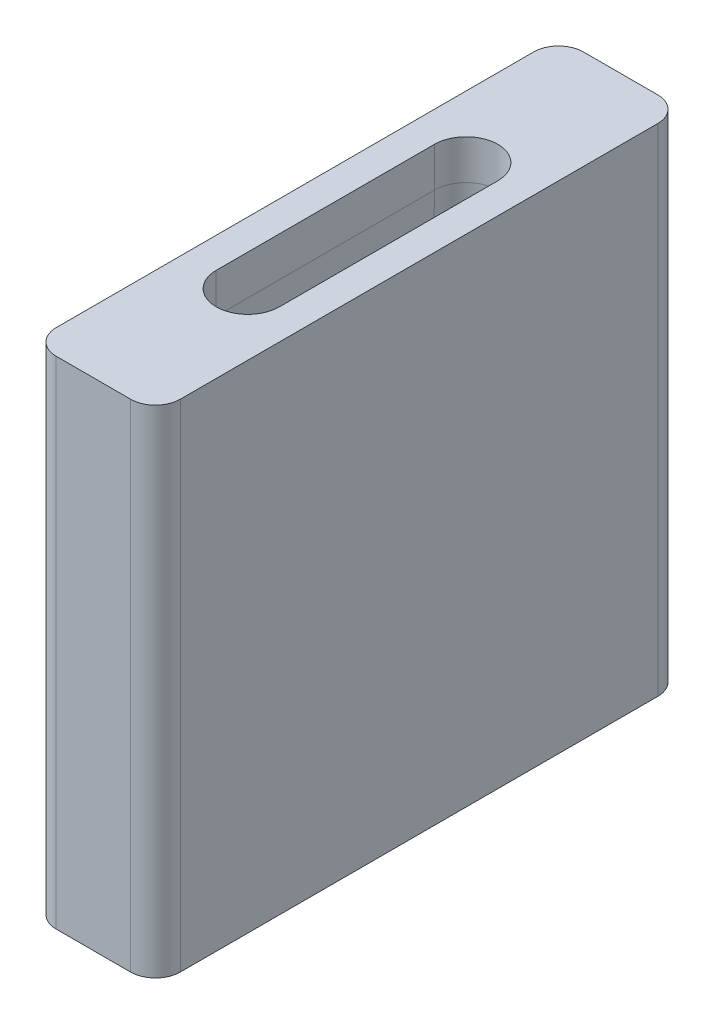
ISO-10303-21;
HEADER;
FILE_DESCRIPTION(('STEP AP214'),'2;1');
FILE_NAME('part.step','',(''),(''),'','','');
FILE_SCHEMA(('AUTOMOTIVE_DESIGN { 1 0 10303 214 1 1 1 1 }'));
ENDSEC;
DATA;
#1=APPLICATION_CONTEXT('core data for automotive mechanical design processes');
#2=APPLICATION_PROTOCOL_DEFINITION('international standard','automotive_design',2000,#1);
#3=PRODUCT_CONTEXT('',#1,'mechanical');
#4=PRODUCT('Part','Part','',(#3));
#5=PRODUCT_RELATED_PRODUCT_CATEGORY('part','',(#4));
#6=PRODUCT_DEFINITION_FORMATION('','',#4);
#7=PRODUCT_DEFINITION_CONTEXT('part definition',#1,'design');
#8=PRODUCT_DEFINITION('design','',#6,#7);
#9=PRODUCT_DEFINITION_SHAPE('','',#8);
#10=(LENGTH_UNIT() NAMED_UNIT(*) SI_UNIT(.MILLI.,.METRE.));
#11=(NAMED_UNIT(*) PLANE_ANGLE_UNIT() SI_UNIT($,.RADIAN.));
#12=(NAMED_UNIT(*) SI_UNIT($,.STERADIAN.) SOLID_ANGLE_UNIT());
#13=UNCERTAINTY_MEASURE_WITH_UNIT(LENGTH_MEASURE(1.E-05),#10,'distance_accuracy_value','');
#14=(GEOMETRIC_REPRESENTATION_CONTEXT(3) GLOBAL_UNCERTAINTY_ASSIGNED_CONTEXT((#13)) GLOBAL_UNIT_ASSIGNED_CONTEXT((#10,
#11,#12)) REPRESENTATION_CONTEXT('',''));
#15=CARTESIAN_POINT('',(0.,0.,0.));
#16=DIRECTION('',(0.,0.,1.));
#17=DIRECTION('',(1.,0.,0.));
#18=AXIS2_PLACEMENT_3D('',#15,#16,#17);
#19=CARTESIAN_POINT('',(0.,-40.001,8.8));
#20=DIRECTION('',(0.,1.,0.));
#21=DIRECTION('',(0.,0.,1.));
#22=AXIS2_PLACEMENT_3D('',#19,#20,#21);
#23=CYLINDRICAL_SURFACE('',#22,2.55);
#24=CARTESIAN_POINT('',(0.,-3.2,8.8));
#25=DIRECTION('',(0.,1.,0.));
#26=DIRECTION('',(-1.,0.,0.));
#27=AXIS2_PLACEMENT_3D('',#24,#25,#26);
#28=CIRCLE('',#27,2.55);
#29=CARTESIAN_POINT('',(-2.55,-3.2,8.8));
#30=VERTEX_POINT('',#29);
#31=CARTESIAN_POINT('',(2.55,-3.20000000000065,8.8));
#32=VERTEX_POINT('',#31);
#33=EDGE_CURVE('E75',#30,#32,#28,.T.);
#34=ORIENTED_EDGE('',*,*,#33,.F.);
#35=DIRECTION('',(0.,1.,0.));
#36=VECTOR('',#35,1.);
#37=CARTESIAN_POINT('',(-2.55,-40.001,8.8));
#38=LINE('',#37,#36);
#39=CARTESIAN_POINT('',(-2.55,0.,8.8));
#40=VERTEX_POINT('',#39);
#41=EDGE_CURVE('E238',#30,#40,#38,.T.);
#42=ORIENTED_EDGE('',*,*,#41,.T.);
#43=CARTESIAN_POINT('',(0.,0.,8.8));
#44=DIRECTION('',(0.,1.,0.));
#45=DIRECTION('',(0.,0.,1.));
#46=AXIS2_PLACEMENT_3D('',#43,#44,#45);
#47=CIRCLE('',#46,2.55);
#48=CARTESIAN_POINT('',(2.55,0.,8.8));
#49=VERTEX_POINT('',#48);
#50=EDGE_CURVE('E224',#40,#49,#47,.T.);
#51=ORIENTED_EDGE('',*,*,#50,.T.);
#52=DIRECTION('',(0.,1.,0.));
#53=VECTOR('',#52,1.);
#54=CARTESIAN_POINT('',(2.55,-40.001,8.8));
#55=LINE('',#54,#53);
#56=EDGE_CURVE('E237',#32,#49,#55,.T.);
#57=ORIENTED_EDGE('',*,*,#56,.F.);
#58=EDGE_LOOP('',(#34,#42,#51,#57));
#59=FACE_BOUND('',#58,.T.);
#60=ADVANCED_FACE('F51',(#59),#23,.F.);
#61=CARTESIAN_POINT('',(-2.55,-40.001,8.8));
#62=DIRECTION('',(-1.,0.,0.));
#63=DIRECTION('',(0.,0.,1.));
#64=AXIS2_PLACEMENT_3D('',#61,#62,#63);
#65=PLANE('',#64);
#66=DIRECTION('',(0.,0.,1.));
#67=VECTOR('',#66,1.);
#68=CARTESIAN_POINT('',(-2.55,-3.2,-8.8));
#69=LINE('',#68,#67);
#70=CARTESIAN_POINT('',(-2.55,-3.2,-8.8));
#71=VERTEX_POINT('',#70);
#72=EDGE_CURVE('E212',#71,#30,#69,.T.);
#73=ORIENTED_EDGE('',*,*,#72,.F.);
#74=DIRECTION('',(0.,1.,0.));
#75=VECTOR('',#74,1.);
#76=CARTESIAN_POINT('',(-2.55,-40.001,-8.8));
#77=LINE('',#76,#75);
#78=CARTESIAN_POINT('',(-2.55,0.,-8.8));
#79=VERTEX_POINT('',#78);
#80=EDGE_CURVE('E241',#71,#79,#77,.T.);
#81=ORIENTED_EDGE('',*,*,#80,.T.);
#82=DIRECTION('',(0.,0.,1.));
#83=VECTOR('',#82,1.);
#84=CARTESIAN_POINT('',(-2.55,0.,8.8));
#85=LINE('',#84,#83);
#86=EDGE_CURVE('E234',#79,#40,#85,.T.);
#87=ORIENTED_EDGE('',*,*,#86,.T.);
#88=ORIENTED_EDGE('',*,*,#41,.F.);
#89=EDGE_LOOP('',(#73,#81,#87,#88));
#90=FACE_BOUND('',#89,.T.);
#91=ADVANCED_FACE('F346',(#90),#65,.F.);
#92=CARTESIAN_POINT('',(0.,-40.001,-8.8));
#93=DIRECTION('',(0.,1.,0.));
#94=DIRECTION('',(0.,0.,1.));
#95=AXIS2_PLACEMENT_3D('',#92,#93,#94);
#96=CYLINDRICAL_SURFACE('',#95,2.55);
#97=CARTESIAN_POINT('',(0.,-3.2,-8.8));
#98=DIRECTION('',(0.,1.,0.));
#99=DIRECTION('',(1.,0.,0.));
#100=AXIS2_PLACEMENT_3D('',#97,#98,#99);
#101=CIRCLE('',#100,2.55);
#102=CARTESIAN_POINT('',(2.55,-3.2,-8.8));
#103=VERTEX_POINT('',#102);
#104=EDGE_CURVE('E204',#103,#71,#101,.T.);
#105=ORIENTED_EDGE('',*,*,#104,.F.);
#106=DIRECTION('',(0.,1.,0.));
#107=VECTOR('',#106,1.);
#108=CARTESIAN_POINT('',(2.55,-40.001,-8.8));
#109=LINE('',#108,#107);
#110=CARTESIAN_POINT('',(2.55,0.,-8.8));
#111=VERTEX_POINT('',#110);
#112=EDGE_CURVE('E243',#103,#111,#109,.T.);
#113=ORIENTED_EDGE('',*,*,#112,.T.);
#114=CARTESIAN_POINT('',(0.,0.,-8.8));
#115=DIRECTION('',(0.,1.,0.));
#116=DIRECTION('',(0.,0.,1.));
#117=AXIS2_PLACEMENT_3D('',#114,#115,#116);
#118=CIRCLE('',#117,2.55);
#119=EDGE_CURVE('E231',#111,#79,#118,.T.);
#120=ORIENTED_EDGE('',*,*,#119,.T.);
#121=ORIENTED_EDGE('',*,*,#80,.F.);
#122=EDGE_LOOP('',(#105,#113,#120,#121));
#123=FACE_BOUND('',#122,.T.);
#124=ADVANCED_FACE('F353',(#123),#96,.F.);
#125=CARTESIAN_POINT('',(2.55,-40.001,8.8));
#126=DIRECTION('',(1.,0.,0.));
#127=DIRECTION('',(0.,0.,-1.));
#128=AXIS2_PLACEMENT_3D('',#125,#126,#127);
#129=PLANE('',#128);
#130=DIRECTION('',(0.,0.,-1.));
#131=VECTOR('',#130,1.);
#132=CARTESIAN_POINT('',(2.55,-3.2,0.));
#133=LINE('',#132,#131);
#134=CARTESIAN_POINT('',(2.55,-3.2,0.));
#135=VERTEX_POINT('',#134);
#136=EDGE_CURVE('E196',#135,#103,#133,.T.);
#137=ORIENTED_EDGE('',*,*,#136,.F.);
#138=DIRECTION('',(0.,0.,-1.));
#139=VECTOR('',#138,1.);
#140=CARTESIAN_POINT('',(2.55,-3.2,8.8));
#141=LINE('',#140,#139);
#142=EDGE_CURVE('E221',#32,#135,#141,.T.);
#143=ORIENTED_EDGE('',*,*,#142,.F.);
#144=ORIENTED_EDGE('',*,*,#56,.T.);
#145=DIRECTION('',(0.,0.,-1.));
#146=VECTOR('',#145,1.);
#147=CARTESIAN_POINT('',(2.55,0.,8.8));
#148=LINE('',#147,#146);
#149=EDGE_CURVE('E228',#49,#111,#148,.T.);
#150=ORIENTED_EDGE('',*,*,#149,.T.);
#151=ORIENTED_EDGE('',*,*,#112,.F.);
#152=EDGE_LOOP('',(#137,#143,#144,#150,#151));
#153=FACE_BOUND('',#152,.T.);
#154=ADVANCED_FACE('F358',(#153),#129,.F.);
#155=CARTESIAN_POINT('',(-3.,-40.,19.25));
#156=DIRECTION('',(0.,1.,0.));
#157=DIRECTION('',(0.,0.,1.));
#158=AXIS2_PLACEMENT_3D('',#155,#156,#157);
#159=CYLINDRICAL_SURFACE('',#158,2.);
#160=CARTESIAN_POINT('',(-3.,0.,19.25));
#161=DIRECTION('',(0.,1.,0.));
#162=DIRECTION('',(0.,0.,-1.));
#163=AXIS2_PLACEMENT_3D('',#160,#161,#162);
#164=CIRCLE('',#163,2.);
#165=CARTESIAN_POINT('',(-5.,0.,19.25));
#166=VERTEX_POINT('',#165);
#167=CARTESIAN_POINT('',(-3.,0.,21.25));
#168=VERTEX_POINT('',#167);
#169=EDGE_CURVE('E240',#166,#168,#164,.T.);
#170=ORIENTED_EDGE('',*,*,#169,.F.);
#171=DIRECTION('',(0.,1.,0.));
#172=VECTOR('',#171,1.);
#173=CARTESIAN_POINT('',(-5.,-40.,19.25));
#174=LINE('',#173,#172);
#175=CARTESIAN_POINT('',(-5.,-40.,19.25));
#176=VERTEX_POINT('',#175);
#177=EDGE_CURVE('E11',#176,#166,#174,.T.);
#178=ORIENTED_EDGE('',*,*,#177,.F.);
#179=CARTESIAN_POINT('',(-3.,-40.,19.25));
#180=DIRECTION('',(0.,1.,0.));
#181=DIRECTION('',(0.,0.,-1.));
#182=AXIS2_PLACEMENT_3D('',#179,#180,#181);
#183=CIRCLE('',#182,2.);
#184=CARTESIAN_POINT('',(-3.,-40.,21.25));
#185=VERTEX_POINT('',#184);
#186=EDGE_CURVE('E246',#176,#185,#183,.T.);
#187=ORIENTED_EDGE('',*,*,#186,.T.);
#188=DIRECTION('',(0.,1.,0.));
#189=VECTOR('',#188,1.);
#190=CARTESIAN_POINT('',(-3.,-40.,21.25));
#191=LINE('',#190,#189);
#192=EDGE_CURVE('E55',#185,#168,#191,.T.);
#193=ORIENTED_EDGE('',*,*,#192,.T.);
#194=EDGE_LOOP('',(#170,#178,#187,#193));
#195=FACE_BOUND('',#194,.T.);
#196=ADVANCED_FACE('F53',(#195),#159,.T.);
#197=CARTESIAN_POINT('',(-5.,-40.,19.25));
#198=DIRECTION('',(-1.,0.,0.));
#199=DIRECTION('',(0.,0.,1.));
#200=AXIS2_PLACEMENT_3D('',#197,#198,#199);
#201=PLANE('',#200);
#202=DIRECTION('',(0.,0.,1.));
#203=VECTOR('',#202,1.);
#204=CARTESIAN_POINT('',(-5.,0.,19.25));
#205=LINE('',#204,#203);
#206=CARTESIAN_POINT('',(-5.,0.,-19.25));
#207=VERTEX_POINT('',#206);
#208=EDGE_CURVE('E250',#207,#166,#205,.T.);
#209=ORIENTED_EDGE('',*,*,#208,.F.);
#210=DIRECTION('',(0.,1.,0.));
#211=VECTOR('',#210,1.);
#212=CARTESIAN_POINT('',(-5.,-40.,-19.25));
#213=LINE('',#212,#211);
#214=CARTESIAN_POINT('',(-5.,-40.,-19.25));
#215=VERTEX_POINT('',#214);
#216=EDGE_CURVE('E60',#215,#207,#213,.T.);
#217=ORIENTED_EDGE('',*,*,#216,.F.);
#218=DIRECTION('',(0.,0.,1.));
#219=VECTOR('',#218,1.);
#220=CARTESIAN_POINT('',(-5.,-40.,19.25));
#221=LINE('',#220,#219);
#222=EDGE_CURVE('E268',#215,#176,#221,.T.);
#223=ORIENTED_EDGE('',*,*,#222,.T.);
#224=ORIENTED_EDGE('',*,*,#177,.T.);
#225=EDGE_LOOP('',(#209,#217,#223,#224));
#226=FACE_BOUND('',#225,.T.);
#227=ADVANCED_FACE('F315',(#226),#201,.T.);
#228=CARTESIAN_POINT('',(-3.,-40.,-19.25));
#229=DIRECTION('',(0.,1.,0.));
#230=DIRECTION('',(0.,0.,1.));
#231=AXIS2_PLACEMENT_3D('',#228,#229,#230);
#232=CYLINDRICAL_SURFACE('',#231,2.);
#233=CARTESIAN_POINT('',(-3.,0.,-19.25));
#234=DIRECTION('',(0.,1.,0.));
#235=DIRECTION('',(0.,0.,-1.));
#236=AXIS2_PLACEMENT_3D('',#233,#234,#235);
#237=CIRCLE('',#236,2.);
#238=CARTESIAN_POINT('',(-3.,0.,-21.25));
#239=VERTEX_POINT('',#238);
#240=EDGE_CURVE('E288',#239,#207,#237,.T.);
#241=ORIENTED_EDGE('',*,*,#240,.F.);
#242=DIRECTION('',(0.,1.,0.));
#243=VECTOR('',#242,1.);
#244=CARTESIAN_POINT('',(-3.,-40.,-21.25));
#245=LINE('',#244,#243);
#246=CARTESIAN_POINT('',(-3.,-40.,-21.25));
#247=VERTEX_POINT('',#246);
#248=EDGE_CURVE('E294',#247,#239,#245,.T.);
#249=ORIENTED_EDGE('',*,*,#248,.F.);
#250=CARTESIAN_POINT('',(-3.,-40.,-19.25));
#251=DIRECTION('',(0.,1.,0.));
#252=DIRECTION('',(0.,0.,-1.));
#253=AXIS2_PLACEMENT_3D('',#250,#251,#252);
#254=CIRCLE('',#253,2.);
#255=EDGE_CURVE('E265',#247,#215,#254,.T.);
#256=ORIENTED_EDGE('',*,*,#255,.T.);
#257=ORIENTED_EDGE('',*,*,#216,.T.);
#258=EDGE_LOOP('',(#241,#249,#256,#257));
#259=FACE_BOUND('',#258,.T.);
#260=ADVANCED_FACE('F336',(#259),#232,.T.);
#261=CARTESIAN_POINT('',(-3.,-40.,-21.25));
#262=DIRECTION('',(0.,0.,-1.));
#263=DIRECTION('',(-1.,0.,0.));
#264=AXIS2_PLACEMENT_3D('',#261,#262,#263);
#265=PLANE('',#264);
#266=DIRECTION('',(-1.,0.,0.));
#267=VECTOR('',#266,1.);
#268=CARTESIAN_POINT('',(-3.,0.,-21.25));
#269=LINE('',#268,#267);
#270=CARTESIAN_POINT('',(3.,0.,-21.25));
#271=VERTEX_POINT('',#270);
#272=EDGE_CURVE('E285',#271,#239,#269,.T.);
#273=ORIENTED_EDGE('',*,*,#272,.F.);
#274=DIRECTION('',(0.,1.,0.));
#275=VECTOR('',#274,1.);
#276=CARTESIAN_POINT('',(3.,-40.,-21.25));
#277=LINE('',#276,#275);
#278=CARTESIAN_POINT('',(3.,-40.,-21.25));
#279=VERTEX_POINT('',#278);
#280=EDGE_CURVE('E296',#279,#271,#277,.T.);
#281=ORIENTED_EDGE('',*,*,#280,.F.);
#282=DIRECTION('',(-1.,0.,0.));
#283=VECTOR('',#282,1.);
#284=CARTESIAN_POINT('',(-3.,-40.,-21.25));
#285=LINE('',#284,#283);
#286=EDGE_CURVE('E262',#279,#247,#285,.T.);
#287=ORIENTED_EDGE('',*,*,#286,.T.);
#288=ORIENTED_EDGE('',*,*,#248,.T.);
#289=EDGE_LOOP('',(#273,#281,#287,#288));
#290=FACE_BOUND('',#289,.T.);
#291=ADVANCED_FACE('F334',(#290),#265,.T.);
#292=CARTESIAN_POINT('',(3.,-40.,-19.25));
#293=DIRECTION('',(0.,1.,0.));
#294=DIRECTION('',(0.,0.,1.));
#295=AXIS2_PLACEMENT_3D('',#292,#293,#294);
#296=CYLINDRICAL_SURFACE('',#295,2.);
#297=CARTESIAN_POINT('',(3.,0.,-19.25));
#298=DIRECTION('',(0.,1.,0.));
#299=DIRECTION('',(0.,0.,-1.));
#300=AXIS2_PLACEMENT_3D('',#297,#298,#299);
#301=CIRCLE('',#300,2.);
#302=CARTESIAN_POINT('',(5.,0.,-19.25));
#303=VERTEX_POINT('',#302);
#304=EDGE_CURVE('E282',#303,#271,#301,.T.);
#305=ORIENTED_EDGE('',*,*,#304,.F.);
#306=DIRECTION('',(0.,1.,0.));
#307=VECTOR('',#306,1.);
#308=CARTESIAN_POINT('',(5.,-40.,-19.25));
#309=LINE('',#308,#307);
#310=CARTESIAN_POINT('',(5.,-40.,-19.25));
#311=VERTEX_POINT('',#310);
#312=EDGE_CURVE('E298',#311,#303,#309,.T.);
#313=ORIENTED_EDGE('',*,*,#312,.F.);
#314=CARTESIAN_POINT('',(3.,-40.,-19.25));
#315=DIRECTION('',(0.,1.,0.));
#316=DIRECTION('',(0.,0.,-1.));
#317=AXIS2_PLACEMENT_3D('',#314,#315,#316);
#318=CIRCLE('',#317,2.);
#319=EDGE_CURVE('E259',#311,#279,#318,.T.);
#320=ORIENTED_EDGE('',*,*,#319,.T.);
#321=ORIENTED_EDGE('',*,*,#280,.T.);
#322=EDGE_LOOP('',(#305,#313,#320,#321));
#323=FACE_BOUND('',#322,.T.);
#324=ADVANCED_FACE('F330',(#323),#296,.T.);
#325=CARTESIAN_POINT('',(5.,-40.,19.25));
#326=DIRECTION('',(1.,0.,0.));
#327=DIRECTION('',(0.,0.,-1.));
#328=AXIS2_PLACEMENT_3D('',#325,#326,#327);
#329=PLANE('',#328);
#330=DIRECTION('',(0.,0.,-1.));
#331=VECTOR('',#330,1.);
#332=CARTESIAN_POINT('',(5.,0.,19.25));
#333=LINE('',#332,#331);
#334=CARTESIAN_POINT('',(5.,0.,19.25));
#335=VERTEX_POINT('',#334);
#336=EDGE_CURVE('E279',#335,#303,#333,.T.);
#337=ORIENTED_EDGE('',*,*,#336,.F.);
#338=DIRECTION('',(0.,1.,0.));
#339=VECTOR('',#338,1.);
#340=CARTESIAN_POINT('',(5.,-40.,19.25));
#341=LINE('',#340,#339);
#342=CARTESIAN_POINT('',(5.,-40.,19.25));
#343=VERTEX_POINT('',#342);
#344=EDGE_CURVE('E300',#343,#335,#341,.T.);
#345=ORIENTED_EDGE('',*,*,#344,.F.);
#346=DIRECTION('',(0.,0.,-1.));
#347=VECTOR('',#346,1.);
#348=CARTESIAN_POINT('',(5.,-40.,19.25));
#349=LINE('',#348,#347);
#350=EDGE_CURVE('E256',#343,#311,#349,.T.);
#351=ORIENTED_EDGE('',*,*,#350,.T.);
#352=ORIENTED_EDGE('',*,*,#312,.T.);
#353=EDGE_LOOP('',(#337,#345,#351,#352));
#354=FACE_BOUND('',#353,.T.);
#355=ADVANCED_FACE('F328',(#354),#329,.T.);
#356=CARTESIAN_POINT('',(3.,-40.,19.25));
#357=DIRECTION('',(0.,1.,0.));
#358=DIRECTION('',(0.,0.,1.));
#359=AXIS2_PLACEMENT_3D('',#356,#357,#358);
#360=CYLINDRICAL_SURFACE('',#359,2.);
#361=CARTESIAN_POINT('',(3.,0.,19.25));
#362=DIRECTION('',(0.,1.,0.));
#363=DIRECTION('',(0.,0.,1.));
#364=AXIS2_PLACEMENT_3D('',#361,#362,#363);
#365=CIRCLE('',#364,2.);
#366=CARTESIAN_POINT('',(3.,0.,21.25));
#367=VERTEX_POINT('',#366);
#368=EDGE_CURVE('E276',#367,#335,#365,.T.);
#369=ORIENTED_EDGE('',*,*,#368,.F.);
#370=DIRECTION('',(0.,1.,0.));
#371=VECTOR('',#370,1.);
#372=CARTESIAN_POINT('',(3.,-40.,21.25));
#373=LINE('',#372,#371);
#374=CARTESIAN_POINT('',(3.,-40.,21.25));
#375=VERTEX_POINT('',#374);
#376=EDGE_CURVE('E301',#375,#367,#373,.T.);
#377=ORIENTED_EDGE('',*,*,#376,.F.);
#378=CARTESIAN_POINT('',(3.,-40.,19.25));
#379=DIRECTION('',(0.,1.,0.));
#380=DIRECTION('',(0.,0.,1.));
#381=AXIS2_PLACEMENT_3D('',#378,#379,#380);
#382=CIRCLE('',#381,2.);
#383=EDGE_CURVE('E253',#375,#343,#382,.T.);
#384=ORIENTED_EDGE('',*,*,#383,.T.);
#385=ORIENTED_EDGE('',*,*,#344,.T.);
#386=EDGE_LOOP('',(#369,#377,#384,#385));
#387=FACE_BOUND('',#386,.T.);
#388=ADVANCED_FACE('F324',(#387),#360,.T.);
#389=CARTESIAN_POINT('',(-3.,-40.,21.25));
#390=DIRECTION('',(0.,0.,1.));
#391=DIRECTION('',(1.,0.,0.));
#392=AXIS2_PLACEMENT_3D('',#389,#390,#391);
#393=PLANE('',#392);
#394=DIRECTION('',(1.,0.,0.));
#395=VECTOR('',#394,1.);
#396=CARTESIAN_POINT('',(-3.,0.,21.25));
#397=LINE('',#396,#395);
#398=EDGE_CURVE('E273',#168,#367,#397,.T.);
#399=ORIENTED_EDGE('',*,*,#398,.F.);
#400=ORIENTED_EDGE('',*,*,#192,.F.);
#401=DIRECTION('',(1.,0.,0.));
#402=VECTOR('',#401,1.);
#403=CARTESIAN_POINT('',(-3.,-40.,21.25));
#404=LINE('',#403,#402);
#405=EDGE_CURVE('E249',#185,#375,#404,.T.);
#406=ORIENTED_EDGE('',*,*,#405,.T.);
#407=ORIENTED_EDGE('',*,*,#376,.T.);
#408=EDGE_LOOP('',(#399,#400,#406,#407));
#409=FACE_BOUND('',#408,.T.);
#410=ADVANCED_FACE('F309',(#409),#393,.T.);
#411=CARTESIAN_POINT('',(-3.,-40.,19.25));
#412=DIRECTION('',(0.,-1.,0.));
#413=DIRECTION('',(0.,0.,-1.));
#414=AXIS2_PLACEMENT_3D('',#411,#412,#413);
#415=PLANE('',#414);
#416=CARTESIAN_POINT('',(0.,-40.,-16.25));
#417=DIRECTION('',(0.,-1.,0.));
#418=DIRECTION('',(0.,0.,-1.));
#419=AXIS2_PLACEMENT_3D('',#416,#417,#418);
#420=CIRCLE('',#419,3.025);
#421=CARTESIAN_POINT('',(0.,-40.,-19.275));
#422=VERTEX_POINT('',#421);
#423=EDGE_CURVE('E181',#422,#422,#420,.T.);
#424=ORIENTED_EDGE('',*,*,#423,.F.);
#425=EDGE_LOOP('',(#424));
#426=FACE_BOUND('',#425,.T.);
#427=CARTESIAN_POINT('',(0.,-40.,16.25));
#428=DIRECTION('',(0.,-1.,0.));
#429=DIRECTION('',(0.,0.,-1.));
#430=AXIS2_PLACEMENT_3D('',#427,#428,#429);
#431=CIRCLE('',#430,3.025);
#432=CARTESIAN_POINT('',(0.,-40.,13.225));
#433=VERTEX_POINT('',#432);
#434=EDGE_CURVE('E174',#433,#433,#431,.T.);
#435=ORIENTED_EDGE('',*,*,#434,.F.);
#436=EDGE_LOOP('',(#435));
#437=FACE_BOUND('',#436,.T.);
#438=CARTESIAN_POINT('',(0.,-40.,8.8));
#439=DIRECTION('',(0.,1.,0.));
#440=DIRECTION('',(-1.,0.,0.));
#441=AXIS2_PLACEMENT_3D('',#438,#439,#440);
#442=CIRCLE('',#441,3.19234638935816);
#443=CARTESIAN_POINT('',(-3.19234638935816,-40.,8.8));
#444=VERTEX_POINT('',#443);
#445=CARTESIAN_POINT('',(3.19234638935816,-40.,8.8));
#446=VERTEX_POINT('',#445);
#447=EDGE_CURVE('E211',#444,#446,#442,.T.);
#448=ORIENTED_EDGE('',*,*,#447,.T.);
#449=DIRECTION('',(0.,0.,-1.));
#450=VECTOR('',#449,1.);
#451=CARTESIAN_POINT('',(3.19234638935816,-40.,8.8));
#452=LINE('',#451,#450);
#453=CARTESIAN_POINT('',(3.19234638935816,-40.,0.));
#454=VERTEX_POINT('',#453);
#455=EDGE_CURVE('E68',#446,#454,#452,.T.);
#456=ORIENTED_EDGE('',*,*,#455,.T.);
#457=DIRECTION('',(0.,0.,-1.));
#458=VECTOR('',#457,1.);
#459=CARTESIAN_POINT('',(3.19234638935816,-40.,0.));
#460=LINE('',#459,#458);
#461=CARTESIAN_POINT('',(3.19234638935816,-40.,-8.8));
#462=VERTEX_POINT('',#461);
#463=EDGE_CURVE('E192',#454,#462,#460,.T.);
#464=ORIENTED_EDGE('',*,*,#463,.T.);
#465=CARTESIAN_POINT('',(0.,-40.,-8.8));
#466=DIRECTION('',(0.,1.,0.));
#467=DIRECTION('',(1.,0.,0.));
#468=AXIS2_PLACEMENT_3D('',#465,#466,#467);
#469=CIRCLE('',#468,3.19234638935816);
#470=CARTESIAN_POINT('',(-3.19234638935816,-40.,-8.8));
#471=VERTEX_POINT('',#470);
#472=EDGE_CURVE('E198',#462,#471,#469,.T.);
#473=ORIENTED_EDGE('',*,*,#472,.T.);
#474=DIRECTION('',(0.,0.,1.));
#475=VECTOR('',#474,1.);
#476=CARTESIAN_POINT('',(-3.19234638935816,-40.,-8.8));
#477=LINE('',#476,#475);
#478=EDGE_CURVE('E206',#471,#444,#477,.T.);
#479=ORIENTED_EDGE('',*,*,#478,.T.);
#480=EDGE_LOOP('',(#448,#456,#464,#473,#479));
#481=FACE_BOUND('',#480,.T.);
#482=ORIENTED_EDGE('',*,*,#186,.F.);
#483=ORIENTED_EDGE('',*,*,#222,.F.);
#484=ORIENTED_EDGE('',*,*,#255,.F.);
#485=ORIENTED_EDGE('',*,*,#286,.F.);
#486=ORIENTED_EDGE('',*,*,#319,.F.);
#487=ORIENTED_EDGE('',*,*,#350,.F.);
#488=ORIENTED_EDGE('',*,*,#383,.F.);
#489=ORIENTED_EDGE('',*,*,#405,.F.);
#490=EDGE_LOOP('',(#482,#483,#484,#485,#486,#487,#488,#489));
#491=FACE_BOUND('',#490,.T.);
#492=ADVANCED_FACE('F318',(#426,#437,#481,#491),#415,.T.);
#493=CARTESIAN_POINT('',(-3.,0.,19.25));
#494=DIRECTION('',(0.,-1.,0.));
#495=DIRECTION('',(0.,0.,-1.));
#496=AXIS2_PLACEMENT_3D('',#493,#494,#495);
#497=PLANE('',#496);
#498=ORIENTED_EDGE('',*,*,#149,.F.);
#499=ORIENTED_EDGE('',*,*,#50,.F.);
#500=ORIENTED_EDGE('',*,*,#86,.F.);
#501=ORIENTED_EDGE('',*,*,#119,.F.);
#502=EDGE_LOOP('',(#498,#499,#500,#501));
#503=FACE_BOUND('',#502,.T.);
#504=ORIENTED_EDGE('',*,*,#169,.T.);
#505=ORIENTED_EDGE('',*,*,#398,.T.);
#506=ORIENTED_EDGE('',*,*,#368,.T.);
#507=ORIENTED_EDGE('',*,*,#336,.T.);
#508=ORIENTED_EDGE('',*,*,#304,.T.);
#509=ORIENTED_EDGE('',*,*,#272,.T.);
#510=ORIENTED_EDGE('',*,*,#240,.T.);
#511=ORIENTED_EDGE('',*,*,#208,.T.);
#512=EDGE_LOOP('',(#504,#505,#506,#507,#508,#509,#510,#511));
#513=FACE_BOUND('',#512,.T.);
#514=ADVANCED_FACE('F311',(#503,#513),#497,.F.);
#515=CARTESIAN_POINT('',(2.55,-3.2,8.8));
#516=DIRECTION('',(-0.999847695156391,-0.0174524064372768,0.));
#517=DIRECTION('',(0.0174524064372768,-0.999847695156391,0.));
#518=AXIS2_PLACEMENT_3D('',#515,#516,#517);
#519=PLANE('',#518);
#520=DIRECTION('',(-0.0174524064372768,0.999847695156391,0.));
#521=VECTOR('',#520,1.);
#522=CARTESIAN_POINT('',(2.55,-3.2,8.8));
#523=LINE('',#522,#521);
#524=EDGE_CURVE('E216',#446,#32,#523,.T.);
#525=ORIENTED_EDGE('',*,*,#524,.T.);
#526=ORIENTED_EDGE('',*,*,#142,.T.);
#527=DIRECTION('',(-0.0174524064372768,0.999847695156391,0.));
#528=VECTOR('',#527,1.);
#529=CARTESIAN_POINT('',(2.55,-3.2,0.));
#530=LINE('',#529,#528);
#531=EDGE_CURVE('E190',#454,#135,#530,.T.);
#532=ORIENTED_EDGE('',*,*,#531,.F.);
#533=ORIENTED_EDGE('',*,*,#455,.F.);
#534=EDGE_LOOP('',(#525,#526,#532,#533));
#535=FACE_BOUND('',#534,.T.);
#536=ADVANCED_FACE('F363',(#535),#519,.T.);
#537=CARTESIAN_POINT('',(2.55,-3.2,0.));
#538=DIRECTION('',(-0.999847695156391,-0.0174524064372768,0.));
#539=DIRECTION('',(0.0174524064372768,-0.999847695156391,0.));
#540=AXIS2_PLACEMENT_3D('',#537,#538,#539);
#541=PLANE('',#540);
#542=ORIENTED_EDGE('',*,*,#136,.T.);
#543=DIRECTION('',(-0.0174524064372768,0.999847695156391,0.));
#544=VECTOR('',#543,1.);
#545=CARTESIAN_POINT('',(2.55,-3.2,-8.8));
#546=LINE('',#545,#544);
#547=EDGE_CURVE('E193',#462,#103,#546,.T.);
#548=ORIENTED_EDGE('',*,*,#547,.F.);
#549=ORIENTED_EDGE('',*,*,#463,.F.);
#550=ORIENTED_EDGE('',*,*,#531,.T.);
#551=EDGE_LOOP('',(#542,#548,#549,#550));
#552=FACE_BOUND('',#551,.T.);
#553=ADVANCED_FACE('F369',(#552),#541,.T.);
#554=CARTESIAN_POINT('',(0.,-40.,-8.8));
#555=DIRECTION('',(0.,-1.,0.));
#556=DIRECTION('',(0.,0.,-1.));
#557=AXIS2_PLACEMENT_3D('',#554,#555,#556);
#558=CONICAL_SURFACE('',#557,3.19234638935816,0.0174532925199366);
#559=ORIENTED_EDGE('',*,*,#104,.T.);
#560=DIRECTION('',(0.0174524064372768,0.999847695156391,0.));
#561=VECTOR('',#560,1.);
#562=CARTESIAN_POINT('',(-2.55,-3.2,-8.8));
#563=LINE('',#562,#561);
#564=EDGE_CURVE('E201',#471,#71,#563,.T.);
#565=ORIENTED_EDGE('',*,*,#564,.F.);
#566=ORIENTED_EDGE('',*,*,#472,.F.);
#567=ORIENTED_EDGE('',*,*,#547,.T.);
#568=EDGE_LOOP('',(#559,#565,#566,#567));
#569=FACE_BOUND('',#568,.T.);
#570=ADVANCED_FACE('F386',(#569),#558,.F.);
#571=CARTESIAN_POINT('',(-2.55,-3.2,-8.8));
#572=DIRECTION('',(0.999847695156391,-0.0174524064372768,0.));
#573=DIRECTION('',(0.0174524064372768,0.999847695156391,0.));
#574=AXIS2_PLACEMENT_3D('',#571,#572,#573);
#575=PLANE('',#574);
#576=ORIENTED_EDGE('',*,*,#72,.T.);
#577=DIRECTION('',(0.0174524064372768,0.999847695156391,0.));
#578=VECTOR('',#577,1.);
#579=CARTESIAN_POINT('',(-2.55,-3.2,8.8));
#580=LINE('',#579,#578);
#581=EDGE_CURVE('E209',#444,#30,#580,.T.);
#582=ORIENTED_EDGE('',*,*,#581,.F.);
#583=ORIENTED_EDGE('',*,*,#478,.F.);
#584=ORIENTED_EDGE('',*,*,#564,.T.);
#585=EDGE_LOOP('',(#576,#582,#583,#584));
#586=FACE_BOUND('',#585,.T.);
#587=ADVANCED_FACE('F390',(#586),#575,.T.);
#588=CARTESIAN_POINT('',(0.,-40.,8.8));
#589=DIRECTION('',(0.,-1.,0.));
#590=DIRECTION('',(0.,0.,-1.));
#591=AXIS2_PLACEMENT_3D('',#588,#589,#590);
#592=CONICAL_SURFACE('',#591,3.19234638935816,0.0174532925199366);
#593=ORIENTED_EDGE('',*,*,#33,.T.);
#594=ORIENTED_EDGE('',*,*,#524,.F.);
#595=ORIENTED_EDGE('',*,*,#447,.F.);
#596=ORIENTED_EDGE('',*,*,#581,.T.);
#597=EDGE_LOOP('',(#593,#594,#595,#596));
#598=FACE_BOUND('',#597,.T.);
#599=ADVANCED_FACE('F395',(#598),#592,.F.);
#600=CARTESIAN_POINT('',(0.,-23.,16.25));
#601=DIRECTION('',(0.,-1.,0.));
#602=DIRECTION('',(0.,0.,-1.));
#603=AXIS2_PLACEMENT_3D('',#600,#601,#602);
#604=CONICAL_SURFACE('',#603,2.5,1.02974425867665);
#605=CARTESIAN_POINT('',(0.,-21.4978484524311,16.25));
#606=VERTEX_POINT('',#605);
#607=VERTEX_LOOP('',#606);
#608=FACE_BOUND('',#607,.T.);
#609=CARTESIAN_POINT('',(0.,-23.,16.25));
#610=DIRECTION('',(0.,-1.,0.));
#611=DIRECTION('',(0.,0.,-1.));
#612=AXIS2_PLACEMENT_3D('',#609,#610,#611);
#613=CIRCLE('',#612,2.5);
#614=CARTESIAN_POINT('',(0.,-23.,13.75));
#615=VERTEX_POINT('',#614);
#616=EDGE_CURVE('E187',#615,#615,#613,.T.);
#617=ORIENTED_EDGE('',*,*,#616,.T.);
#618=EDGE_LOOP('',(#617));
#619=FACE_BOUND('',#618,.T.);
#620=ADVANCED_FACE('F397',(#608,#619),#604,.F.);
#621=CARTESIAN_POINT('',(0.,-40.,16.25));
#622=DIRECTION('',(0.,-1.,0.));
#623=DIRECTION('',(0.,0.,-1.));
#624=AXIS2_PLACEMENT_3D('',#621,#622,#623);
#625=CYLINDRICAL_SURFACE('',#624,2.5);
#626=ORIENTED_EDGE('',*,*,#616,.F.);
#627=EDGE_LOOP('',(#626));
#628=FACE_BOUND('',#627,.T.);
#629=CARTESIAN_POINT('',(0.,-39.475,16.25));
#630=DIRECTION('',(0.,-1.,0.));
#631=DIRECTION('',(0.,0.,-1.));
#632=AXIS2_PLACEMENT_3D('',#629,#630,#631);
#633=CIRCLE('',#632,2.5);
#634=CARTESIAN_POINT('',(0.,-39.475,13.75));
#635=VERTEX_POINT('',#634);
#636=EDGE_CURVE('E178',#635,#635,#633,.T.);
#637=ORIENTED_EDGE('',*,*,#636,.T.);
#638=EDGE_LOOP('',(#637));
#639=FACE_BOUND('',#638,.T.);
#640=ADVANCED_FACE('F404',(#628,#639),#625,.F.);
#641=CARTESIAN_POINT('',(0.,-40.,16.25));
#642=DIRECTION('',(0.,-1.,0.));
#643=DIRECTION('',(0.,0.,-1.));
#644=AXIS2_PLACEMENT_3D('',#641,#642,#643);
#645=CONICAL_SURFACE('',#644,3.025,0.785398163397452);
#646=ORIENTED_EDGE('',*,*,#636,.F.);
#647=EDGE_LOOP('',(#646));
#648=FACE_BOUND('',#647,.T.);
#649=ORIENTED_EDGE('',*,*,#434,.T.);
#650=EDGE_LOOP('',(#649));
#651=FACE_BOUND('',#650,.T.);
#652=ADVANCED_FACE('F168',(#648,#651),#645,.F.);
#653=CARTESIAN_POINT('',(0.,-23.,-16.25));
#654=DIRECTION('',(0.,-1.,0.));
#655=DIRECTION('',(0.,0.,-1.));
#656=AXIS2_PLACEMENT_3D('',#653,#654,#655);
#657=CONICAL_SURFACE('',#656,2.5,1.02974425867665);
#658=CARTESIAN_POINT('',(0.,-21.4978484524311,-16.25));
#659=VERTEX_POINT('',#658);
#660=VERTEX_LOOP('',#659);
#661=FACE_BOUND('',#660,.T.);
#662=CARTESIAN_POINT('',(0.,-23.,-16.25));
#663=DIRECTION('',(0.,-1.,0.));
#664=DIRECTION('',(0.,0.,-1.));
#665=AXIS2_PLACEMENT_3D('',#662,#663,#664);
#666=CIRCLE('',#665,2.5);
#667=CARTESIAN_POINT('',(0.,-23.,-18.75));
#668=VERTEX_POINT('',#667);
#669=EDGE_CURVE('E172',#668,#668,#666,.T.);
#670=ORIENTED_EDGE('',*,*,#669,.T.);
#671=EDGE_LOOP('',(#670));
#672=FACE_BOUND('',#671,.T.);
#673=ADVANCED_FACE('F164',(#661,#672),#657,.F.);
#674=CARTESIAN_POINT('',(0.,-40.,-16.25));
#675=DIRECTION('',(0.,-1.,0.));
#676=DIRECTION('',(0.,0.,-1.));
#677=AXIS2_PLACEMENT_3D('',#674,#675,#676);
#678=CYLINDRICAL_SURFACE('',#677,2.5);
#679=ORIENTED_EDGE('',*,*,#669,.F.);
#680=EDGE_LOOP('',(#679));
#681=FACE_BOUND('',#680,.T.);
#682=CARTESIAN_POINT('',(0.,-39.475,-16.25));
#683=DIRECTION('',(0.,-1.,0.));
#684=DIRECTION('',(0.,0.,-1.));
#685=AXIS2_PLACEMENT_3D('',#682,#683,#684);
#686=CIRCLE('',#685,2.5);
#687=CARTESIAN_POINT('',(0.,-39.475,-18.75));
#688=VERTEX_POINT('',#687);
#689=EDGE_CURVE('E175',#688,#688,#686,.T.);
#690=ORIENTED_EDGE('',*,*,#689,.T.);
#691=EDGE_LOOP('',(#690));
#692=FACE_BOUND('',#691,.T.);
#693=ADVANCED_FACE('F167',(#681,#692),#678,.F.);
#694=CARTESIAN_POINT('',(0.,-40.,-16.25));
#695=DIRECTION('',(0.,-1.,0.));
#696=DIRECTION('',(0.,0.,-1.));
#697=AXIS2_PLACEMENT_3D('',#694,#695,#696);
#698=CONICAL_SURFACE('',#697,3.025,0.785398163397452);
#699=ORIENTED_EDGE('',*,*,#689,.F.);
#700=EDGE_LOOP('',(#699));
#701=FACE_BOUND('',#700,.T.);
#702=ORIENTED_EDGE('',*,*,#423,.T.);
#703=EDGE_LOOP('',(#702));
#704=FACE_BOUND('',#703,.T.);
#705=ADVANCED_FACE('F566',(#701,#704),#698,.F.);
#706=CLOSED_SHELL('',(#60,#91,#124,#154,#196,#227,#260,#291,#324,#355,#388,#410,#492,#514,#536,
#553,#570,#587,#599,#620,#640,#652,#673,#693,#705));
#707=MANIFOLD_SOLID_BREP('B2',#706);
#708=ADVANCED_BREP_SHAPE_REPRESENTATION('',(#18,#707),#14);
#709=SHAPE_DEFINITION_REPRESENTATION(#9,#708);
ENDSEC;
END-ISO-10303-21;
